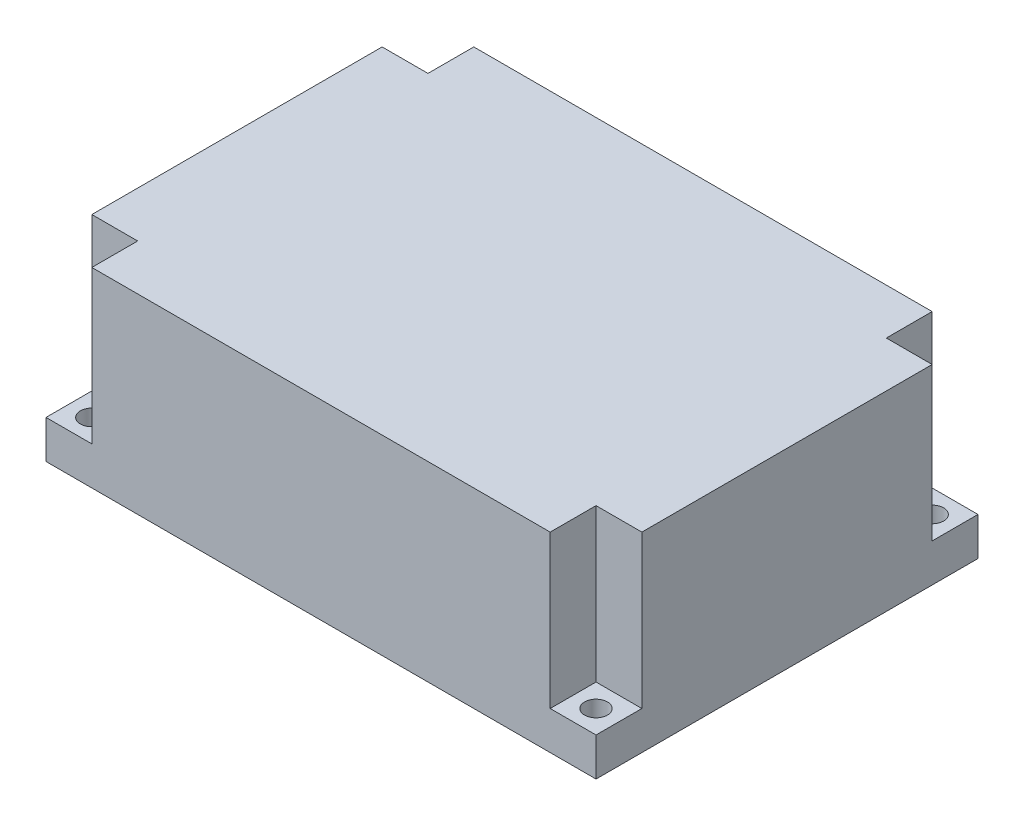
ISO-10303-21;
HEADER;
FILE_DESCRIPTION(('STEP AP214'),'2;1');
FILE_NAME('part.step','',(''),(''),'','','');
FILE_SCHEMA(('AUTOMOTIVE_DESIGN { 1 0 10303 214 1 1 1 1 }'));
ENDSEC;
DATA;
#1=APPLICATION_CONTEXT('core data for automotive mechanical design processes');
#2=APPLICATION_PROTOCOL_DEFINITION('international standard','automotive_design',2000,#1);
#3=PRODUCT_CONTEXT('',#1,'mechanical');
#4=PRODUCT('Part','Part','',(#3));
#5=PRODUCT_RELATED_PRODUCT_CATEGORY('part','',(#4));
#6=PRODUCT_DEFINITION_FORMATION('','',#4);
#7=PRODUCT_DEFINITION_CONTEXT('part definition',#1,'design');
#8=PRODUCT_DEFINITION('design','',#6,#7);
#9=PRODUCT_DEFINITION_SHAPE('','',#8);
#10=(LENGTH_UNIT() NAMED_UNIT(*) SI_UNIT(.MILLI.,.METRE.));
#11=(NAMED_UNIT(*) PLANE_ANGLE_UNIT() SI_UNIT($,.RADIAN.));
#12=(NAMED_UNIT(*) SI_UNIT($,.STERADIAN.) SOLID_ANGLE_UNIT());
#13=UNCERTAINTY_MEASURE_WITH_UNIT(LENGTH_MEASURE(1.E-05),#10,'distance_accuracy_value','');
#14=(GEOMETRIC_REPRESENTATION_CONTEXT(3) GLOBAL_UNCERTAINTY_ASSIGNED_CONTEXT((#13)) GLOBAL_UNIT_ASSIGNED_CONTEXT((#10,
#11,#12)) REPRESENTATION_CONTEXT('',''));
#15=CARTESIAN_POINT('',(0.,0.,0.));
#16=DIRECTION('',(0.,0.,1.));
#17=DIRECTION('',(1.,0.,0.));
#18=AXIS2_PLACEMENT_3D('',#15,#16,#17);
#19=CARTESIAN_POINT('',(-33.,0.,-22.));
#20=DIRECTION('',(0.,1.,0.));
#21=DIRECTION('',(0.,0.,1.));
#22=AXIS2_PLACEMENT_3D('',#19,#20,#21);
#23=CYLINDRICAL_SURFACE('',#22,1.5);
#24=CARTESIAN_POINT('',(-33.,0.,-22.));
#25=DIRECTION('',(0.,1.,0.));
#26=DIRECTION('',(0.,0.,1.));
#27=AXIS2_PLACEMENT_3D('',#24,#25,#26);
#28=CIRCLE('',#27,1.5);
#29=CARTESIAN_POINT('',(-33.,0.,-20.5));
#30=VERTEX_POINT('',#29);
#31=EDGE_CURVE('E185',#30,#30,#28,.T.);
#32=ORIENTED_EDGE('',*,*,#31,.F.);
#33=EDGE_LOOP('',(#32));
#34=FACE_BOUND('',#33,.T.);
#35=CARTESIAN_POINT('',(-33.,5.,-22.));
#36=DIRECTION('',(0.,1.,0.));
#37=DIRECTION('',(0.,0.,1.));
#38=AXIS2_PLACEMENT_3D('',#35,#36,#37);
#39=CIRCLE('',#38,1.5);
#40=CARTESIAN_POINT('',(-33.,5.,-20.5));
#41=VERTEX_POINT('',#40);
#42=EDGE_CURVE('E39',#41,#41,#39,.F.);
#43=ORIENTED_EDGE('',*,*,#42,.F.);
#44=EDGE_LOOP('',(#43));
#45=FACE_BOUND('',#44,.T.);
#46=ADVANCED_FACE('F35',(#34,#45),#23,.F.);
#47=CARTESIAN_POINT('',(33.,0.,22.));
#48=DIRECTION('',(0.,1.,0.));
#49=DIRECTION('',(0.,0.,1.));
#50=AXIS2_PLACEMENT_3D('',#47,#48,#49);
#51=CYLINDRICAL_SURFACE('',#50,1.5);
#52=CARTESIAN_POINT('',(33.,0.,22.));
#53=DIRECTION('',(0.,1.,0.));
#54=DIRECTION('',(0.,0.,1.));
#55=AXIS2_PLACEMENT_3D('',#52,#53,#54);
#56=CIRCLE('',#55,1.5);
#57=CARTESIAN_POINT('',(33.,0.,23.5));
#58=VERTEX_POINT('',#57);
#59=EDGE_CURVE('E220',#58,#58,#56,.T.);
#60=ORIENTED_EDGE('',*,*,#59,.F.);
#61=EDGE_LOOP('',(#60));
#62=FACE_BOUND('',#61,.T.);
#63=CARTESIAN_POINT('',(33.,5.,22.));
#64=DIRECTION('',(0.,1.,0.));
#65=DIRECTION('',(0.,0.,1.));
#66=AXIS2_PLACEMENT_3D('',#63,#64,#65);
#67=CIRCLE('',#66,1.5);
#68=CARTESIAN_POINT('',(33.,5.,23.5));
#69=VERTEX_POINT('',#68);
#70=EDGE_CURVE('E208',#69,#69,#67,.F.);
#71=ORIENTED_EDGE('',*,*,#70,.F.);
#72=EDGE_LOOP('',(#71));
#73=FACE_BOUND('',#72,.T.);
#74=ADVANCED_FACE('F327',(#62,#73),#51,.F.);
#75=CARTESIAN_POINT('',(36.,25.,25.));
#76=DIRECTION('',(-1.,0.,0.));
#77=DIRECTION('',(0.,0.,1.));
#78=AXIS2_PLACEMENT_3D('',#75,#76,#77);
#79=PLANE('',#78);
#80=DIRECTION('',(0.,0.,-1.));
#81=VECTOR('',#80,1.);
#82=CARTESIAN_POINT('',(36.,25.,25.));
#83=LINE('',#82,#81);
#84=CARTESIAN_POINT('',(36.,25.,19.));
#85=VERTEX_POINT('',#84);
#86=CARTESIAN_POINT('',(36.,25.,-19.));
#87=VERTEX_POINT('',#86);
#88=EDGE_CURVE('E200',#85,#87,#83,.T.);
#89=ORIENTED_EDGE('',*,*,#88,.F.);
#90=DIRECTION('',(0.,1.,0.));
#91=VECTOR('',#90,1.);
#92=CARTESIAN_POINT('',(36.,5.,19.));
#93=LINE('',#92,#91);
#94=CARTESIAN_POINT('',(36.,5.,19.));
#95=VERTEX_POINT('',#94);
#96=EDGE_CURVE('E259',#95,#85,#93,.T.);
#97=ORIENTED_EDGE('',*,*,#96,.F.);
#98=DIRECTION('',(0.,0.,-1.));
#99=VECTOR('',#98,1.);
#100=CARTESIAN_POINT('',(36.,5.,25.));
#101=LINE('',#100,#99);
#102=CARTESIAN_POINT('',(36.,5.,25.));
#103=VERTEX_POINT('',#102);
#104=EDGE_CURVE('E535',#103,#95,#101,.T.);
#105=ORIENTED_EDGE('',*,*,#104,.F.);
#106=DIRECTION('',(0.,-1.,0.));
#107=VECTOR('',#106,1.);
#108=CARTESIAN_POINT('',(36.,25.,25.));
#109=LINE('',#108,#107);
#110=CARTESIAN_POINT('',(36.,0.,25.));
#111=VERTEX_POINT('',#110);
#112=EDGE_CURVE('E180',#103,#111,#109,.T.);
#113=ORIENTED_EDGE('',*,*,#112,.T.);
#114=DIRECTION('',(0.,0.,-1.));
#115=VECTOR('',#114,1.);
#116=CARTESIAN_POINT('',(36.,0.,25.));
#117=LINE('',#116,#115);
#118=CARTESIAN_POINT('',(36.,0.,-25.));
#119=VERTEX_POINT('',#118);
#120=EDGE_CURVE('E177',#111,#119,#117,.T.);
#121=ORIENTED_EDGE('',*,*,#120,.T.);
#122=DIRECTION('',(0.,-1.,0.));
#123=VECTOR('',#122,1.);
#124=CARTESIAN_POINT('',(36.,25.,-25.));
#125=LINE('',#124,#123);
#126=CARTESIAN_POINT('',(36.,5.,-25.));
#127=VERTEX_POINT('',#126);
#128=EDGE_CURVE('E11',#127,#119,#125,.T.);
#129=ORIENTED_EDGE('',*,*,#128,.F.);
#130=DIRECTION('',(0.,0.,-1.));
#131=VECTOR('',#130,1.);
#132=CARTESIAN_POINT('',(36.,5.,-25.));
#133=LINE('',#132,#131);
#134=CARTESIAN_POINT('',(36.,5.,-19.));
#135=VERTEX_POINT('',#134);
#136=EDGE_CURVE('E152',#135,#127,#133,.T.);
#137=ORIENTED_EDGE('',*,*,#136,.F.);
#138=DIRECTION('',(0.,1.,0.));
#139=VECTOR('',#138,1.);
#140=CARTESIAN_POINT('',(36.,5.,-19.));
#141=LINE('',#140,#139);
#142=EDGE_CURVE('E300',#135,#87,#141,.T.);
#143=ORIENTED_EDGE('',*,*,#142,.T.);
#144=EDGE_LOOP('',(#89,#97,#105,#113,#121,#129,#137,#143));
#145=FACE_BOUND('',#144,.T.);
#146=ADVANCED_FACE('F37',(#145),#79,.F.);
#147=CARTESIAN_POINT('',(-36.,25.,-25.));
#148=DIRECTION('',(0.,0.,1.));
#149=DIRECTION('',(1.,0.,0.));
#150=AXIS2_PLACEMENT_3D('',#147,#148,#149);
#151=PLANE('',#150);
#152=DIRECTION('',(-1.,0.,0.));
#153=VECTOR('',#152,1.);
#154=CARTESIAN_POINT('',(-36.,25.,-25.));
#155=LINE('',#154,#153);
#156=CARTESIAN_POINT('',(30.,25.,-25.));
#157=VERTEX_POINT('',#156);
#158=CARTESIAN_POINT('',(-30.,25.,-25.));
#159=VERTEX_POINT('',#158);
#160=EDGE_CURVE('E230',#157,#159,#155,.T.);
#161=ORIENTED_EDGE('',*,*,#160,.F.);
#162=DIRECTION('',(0.,1.,0.));
#163=VECTOR('',#162,1.);
#164=CARTESIAN_POINT('',(30.,5.,-25.));
#165=LINE('',#164,#163);
#166=CARTESIAN_POINT('',(30.,5.,-25.));
#167=VERTEX_POINT('',#166);
#168=EDGE_CURVE('E171',#167,#157,#165,.T.);
#169=ORIENTED_EDGE('',*,*,#168,.F.);
#170=DIRECTION('',(-1.,0.,0.));
#171=VECTOR('',#170,1.);
#172=CARTESIAN_POINT('',(36.,5.,-25.));
#173=LINE('',#172,#171);
#174=EDGE_CURVE('E157',#127,#167,#173,.T.);
#175=ORIENTED_EDGE('',*,*,#174,.F.);
#176=ORIENTED_EDGE('',*,*,#128,.T.);
#177=DIRECTION('',(-1.,0.,0.));
#178=VECTOR('',#177,1.);
#179=CARTESIAN_POINT('',(-36.,0.,-25.));
#180=LINE('',#179,#178);
#181=CARTESIAN_POINT('',(-36.,0.,-25.));
#182=VERTEX_POINT('',#181);
#183=EDGE_CURVE('E184',#119,#182,#180,.T.);
#184=ORIENTED_EDGE('',*,*,#183,.T.);
#185=DIRECTION('',(0.,-1.,0.));
#186=VECTOR('',#185,1.);
#187=CARTESIAN_POINT('',(-36.,25.,-25.));
#188=LINE('',#187,#186);
#189=CARTESIAN_POINT('',(-36.,5.,-25.));
#190=VERTEX_POINT('',#189);
#191=EDGE_CURVE('E44',#190,#182,#188,.T.);
#192=ORIENTED_EDGE('',*,*,#191,.F.);
#193=DIRECTION('',(-1.,0.,0.));
#194=VECTOR('',#193,1.);
#195=CARTESIAN_POINT('',(-36.,5.,-25.));
#196=LINE('',#195,#194);
#197=CARTESIAN_POINT('',(-30.,5.,-25.));
#198=VERTEX_POINT('',#197);
#199=EDGE_CURVE('E296',#198,#190,#196,.T.);
#200=ORIENTED_EDGE('',*,*,#199,.F.);
#201=DIRECTION('',(0.,1.,0.));
#202=VECTOR('',#201,1.);
#203=CARTESIAN_POINT('',(-30.,5.,-25.));
#204=LINE('',#203,#202);
#205=EDGE_CURVE('E209',#198,#159,#204,.T.);
#206=ORIENTED_EDGE('',*,*,#205,.T.);
#207=EDGE_LOOP('',(#161,#169,#175,#176,#184,#192,#200,#206));
#208=FACE_BOUND('',#207,.T.);
#209=ADVANCED_FACE('F168',(#208),#151,.F.);
#210=CARTESIAN_POINT('',(-36.,25.,25.));
#211=DIRECTION('',(1.,0.,0.));
#212=DIRECTION('',(0.,0.,-1.));
#213=AXIS2_PLACEMENT_3D('',#210,#211,#212);
#214=PLANE('',#213);
#215=DIRECTION('',(0.,0.,1.));
#216=VECTOR('',#215,1.);
#217=CARTESIAN_POINT('',(-36.,5.,25.));
#218=LINE('',#217,#216);
#219=CARTESIAN_POINT('',(-36.,5.,19.));
#220=VERTEX_POINT('',#219);
#221=CARTESIAN_POINT('',(-36.,5.,25.));
#222=VERTEX_POINT('',#221);
#223=EDGE_CURVE('E265',#220,#222,#218,.T.);
#224=ORIENTED_EDGE('',*,*,#223,.F.);
#225=DIRECTION('',(0.,1.,0.));
#226=VECTOR('',#225,1.);
#227=CARTESIAN_POINT('',(-36.,5.,19.));
#228=LINE('',#227,#226);
#229=CARTESIAN_POINT('',(-36.,25.,19.));
#230=VERTEX_POINT('',#229);
#231=EDGE_CURVE('E279',#220,#230,#228,.T.);
#232=ORIENTED_EDGE('',*,*,#231,.T.);
#233=DIRECTION('',(0.,0.,1.));
#234=VECTOR('',#233,1.);
#235=CARTESIAN_POINT('',(-36.,25.,25.));
#236=LINE('',#235,#234);
#237=CARTESIAN_POINT('',(-36.,25.,-19.));
#238=VERTEX_POINT('',#237);
#239=EDGE_CURVE('E232',#238,#230,#236,.T.);
#240=ORIENTED_EDGE('',*,*,#239,.F.);
#241=DIRECTION('',(0.,1.,0.));
#242=VECTOR('',#241,1.);
#243=CARTESIAN_POINT('',(-36.,5.,-19.));
#244=LINE('',#243,#242);
#245=CARTESIAN_POINT('',(-36.,5.,-19.));
#246=VERTEX_POINT('',#245);
#247=EDGE_CURVE('E60',#246,#238,#244,.T.);
#248=ORIENTED_EDGE('',*,*,#247,.F.);
#249=DIRECTION('',(0.,0.,1.));
#250=VECTOR('',#249,1.);
#251=CARTESIAN_POINT('',(-36.,5.,-25.));
#252=LINE('',#251,#250);
#253=EDGE_CURVE('E286',#190,#246,#252,.T.);
#254=ORIENTED_EDGE('',*,*,#253,.F.);
#255=ORIENTED_EDGE('',*,*,#191,.T.);
#256=DIRECTION('',(0.,0.,1.));
#257=VECTOR('',#256,1.);
#258=CARTESIAN_POINT('',(-36.,0.,25.));
#259=LINE('',#258,#257);
#260=CARTESIAN_POINT('',(-36.,0.,25.));
#261=VERTEX_POINT('',#260);
#262=EDGE_CURVE('E187',#182,#261,#259,.T.);
#263=ORIENTED_EDGE('',*,*,#262,.T.);
#264=DIRECTION('',(0.,-1.,0.));
#265=VECTOR('',#264,1.);
#266=CARTESIAN_POINT('',(-36.,25.,25.));
#267=LINE('',#266,#265);
#268=EDGE_CURVE('E202',#222,#261,#267,.T.);
#269=ORIENTED_EDGE('',*,*,#268,.F.);
#270=EDGE_LOOP('',(#224,#232,#240,#248,#254,#255,#263,#269));
#271=FACE_BOUND('',#270,.T.);
#272=ADVANCED_FACE('F341',(#271),#214,.F.);
#273=CARTESIAN_POINT('',(-36.,25.,25.));
#274=DIRECTION('',(0.,0.,-1.));
#275=DIRECTION('',(-1.,0.,0.));
#276=AXIS2_PLACEMENT_3D('',#273,#274,#275);
#277=PLANE('',#276);
#278=DIRECTION('',(1.,0.,0.));
#279=VECTOR('',#278,1.);
#280=CARTESIAN_POINT('',(-36.,25.,25.));
#281=LINE('',#280,#279);
#282=CARTESIAN_POINT('',(-30.,25.,25.));
#283=VERTEX_POINT('',#282);
#284=CARTESIAN_POINT('',(30.,25.,25.));
#285=VERTEX_POINT('',#284);
#286=EDGE_CURVE('E193',#283,#285,#281,.T.);
#287=ORIENTED_EDGE('',*,*,#286,.F.);
#288=DIRECTION('',(0.,1.,0.));
#289=VECTOR('',#288,1.);
#290=CARTESIAN_POINT('',(-30.,5.,25.));
#291=LINE('',#290,#289);
#292=CARTESIAN_POINT('',(-30.,5.,25.));
#293=VERTEX_POINT('',#292);
#294=EDGE_CURVE('E52',#293,#283,#291,.T.);
#295=ORIENTED_EDGE('',*,*,#294,.F.);
#296=DIRECTION('',(1.,0.,0.));
#297=VECTOR('',#296,1.);
#298=CARTESIAN_POINT('',(-36.,5.,25.));
#299=LINE('',#298,#297);
#300=EDGE_CURVE('E267',#222,#293,#299,.T.);
#301=ORIENTED_EDGE('',*,*,#300,.F.);
#302=ORIENTED_EDGE('',*,*,#268,.T.);
#303=DIRECTION('',(1.,0.,0.));
#304=VECTOR('',#303,1.);
#305=CARTESIAN_POINT('',(-36.,0.,25.));
#306=LINE('',#305,#304);
#307=EDGE_CURVE('E198',#261,#111,#306,.T.);
#308=ORIENTED_EDGE('',*,*,#307,.T.);
#309=ORIENTED_EDGE('',*,*,#112,.F.);
#310=DIRECTION('',(1.,0.,0.));
#311=VECTOR('',#310,1.);
#312=CARTESIAN_POINT('',(36.,5.,25.));
#313=LINE('',#312,#311);
#314=CARTESIAN_POINT('',(30.,5.,25.));
#315=VERTEX_POINT('',#314);
#316=EDGE_CURVE('E250',#315,#103,#313,.T.);
#317=ORIENTED_EDGE('',*,*,#316,.F.);
#318=DIRECTION('',(0.,1.,0.));
#319=VECTOR('',#318,1.);
#320=CARTESIAN_POINT('',(30.,5.,25.));
#321=LINE('',#320,#319);
#322=EDGE_CURVE('E249',#315,#285,#321,.T.);
#323=ORIENTED_EDGE('',*,*,#322,.T.);
#324=EDGE_LOOP('',(#287,#295,#301,#302,#308,#309,#317,#323));
#325=FACE_BOUND('',#324,.T.);
#326=ADVANCED_FACE('F246',(#325),#277,.F.);
#327=CARTESIAN_POINT('',(0.,25.,0.));
#328=DIRECTION('',(0.,-1.,0.));
#329=DIRECTION('',(0.,0.,-1.));
#330=AXIS2_PLACEMENT_3D('',#327,#328,#329);
#331=PLANE('',#330);
#332=ORIENTED_EDGE('',*,*,#239,.T.);
#333=DIRECTION('',(-1.,0.,0.));
#334=VECTOR('',#333,1.);
#335=CARTESIAN_POINT('',(-36.,25.,19.));
#336=LINE('',#335,#334);
#337=CARTESIAN_POINT('',(-30.,25.,19.));
#338=VERTEX_POINT('',#337);
#339=EDGE_CURVE('E268',#338,#230,#336,.T.);
#340=ORIENTED_EDGE('',*,*,#339,.F.);
#341=DIRECTION('',(0.,0.,-1.));
#342=VECTOR('',#341,1.);
#343=CARTESIAN_POINT('',(-30.,25.,25.));
#344=LINE('',#343,#342);
#345=EDGE_CURVE('E243',#283,#338,#344,.T.);
#346=ORIENTED_EDGE('',*,*,#345,.F.);
#347=ORIENTED_EDGE('',*,*,#286,.T.);
#348=DIRECTION('',(0.,0.,1.));
#349=VECTOR('',#348,1.);
#350=CARTESIAN_POINT('',(30.,25.,25.));
#351=LINE('',#350,#349);
#352=CARTESIAN_POINT('',(30.,25.,19.));
#353=VERTEX_POINT('',#352);
#354=EDGE_CURVE('E242',#353,#285,#351,.T.);
#355=ORIENTED_EDGE('',*,*,#354,.F.);
#356=DIRECTION('',(-1.,0.,0.));
#357=VECTOR('',#356,1.);
#358=CARTESIAN_POINT('',(36.,25.,19.));
#359=LINE('',#358,#357);
#360=EDGE_CURVE('E282',#85,#353,#359,.T.);
#361=ORIENTED_EDGE('',*,*,#360,.F.);
#362=ORIENTED_EDGE('',*,*,#88,.T.);
#363=DIRECTION('',(1.,0.,0.));
#364=VECTOR('',#363,1.);
#365=CARTESIAN_POINT('',(36.,25.,-19.));
#366=LINE('',#365,#364);
#367=CARTESIAN_POINT('',(30.,25.,-19.));
#368=VERTEX_POINT('',#367);
#369=EDGE_CURVE('E164',#368,#87,#366,.T.);
#370=ORIENTED_EDGE('',*,*,#369,.F.);
#371=DIRECTION('',(0.,0.,1.));
#372=VECTOR('',#371,1.);
#373=CARTESIAN_POINT('',(30.,25.,-25.));
#374=LINE('',#373,#372);
#375=EDGE_CURVE('E254',#157,#368,#374,.T.);
#376=ORIENTED_EDGE('',*,*,#375,.F.);
#377=ORIENTED_EDGE('',*,*,#160,.T.);
#378=DIRECTION('',(0.,0.,-1.));
#379=VECTOR('',#378,1.);
#380=CARTESIAN_POINT('',(-30.,25.,-25.));
#381=LINE('',#380,#379);
#382=CARTESIAN_POINT('',(-30.,25.,-19.));
#383=VERTEX_POINT('',#382);
#384=EDGE_CURVE('E290',#383,#159,#381,.T.);
#385=ORIENTED_EDGE('',*,*,#384,.F.);
#386=DIRECTION('',(1.,0.,0.));
#387=VECTOR('',#386,1.);
#388=CARTESIAN_POINT('',(-36.,25.,-19.));
#389=LINE('',#388,#387);
#390=EDGE_CURVE('E298',#238,#383,#389,.T.);
#391=ORIENTED_EDGE('',*,*,#390,.F.);
#392=EDGE_LOOP('',(#332,#340,#346,#347,#355,#361,#362,#370,#376,#377,#385,#391));
#393=FACE_BOUND('',#392,.T.);
#394=ADVANCED_FACE('F240',(#393),#331,.F.);
#395=CARTESIAN_POINT('',(0.,0.,0.));
#396=DIRECTION('',(0.,-1.,0.));
#397=DIRECTION('',(0.,0.,-1.));
#398=AXIS2_PLACEMENT_3D('',#395,#396,#397);
#399=PLANE('',#398);
#400=CARTESIAN_POINT('',(-33.,0.,22.));
#401=DIRECTION('',(0.,1.,0.));
#402=DIRECTION('',(0.,0.,-1.));
#403=AXIS2_PLACEMENT_3D('',#400,#401,#402);
#404=CIRCLE('',#403,1.5);
#405=CARTESIAN_POINT('',(-33.,0.,20.5));
#406=VERTEX_POINT('',#405);
#407=EDGE_CURVE('E216',#406,#406,#404,.T.);
#408=ORIENTED_EDGE('',*,*,#407,.T.);
#409=EDGE_LOOP('',(#408));
#410=FACE_BOUND('',#409,.T.);
#411=ORIENTED_EDGE('',*,*,#59,.T.);
#412=EDGE_LOOP('',(#411));
#413=FACE_BOUND('',#412,.T.);
#414=CARTESIAN_POINT('',(33.,0.,-22.));
#415=DIRECTION('',(0.,1.,0.));
#416=DIRECTION('',(0.,0.,-1.));
#417=AXIS2_PLACEMENT_3D('',#414,#415,#416);
#418=CIRCLE('',#417,1.5);
#419=CARTESIAN_POINT('',(33.,0.,-23.5));
#420=VERTEX_POINT('',#419);
#421=EDGE_CURVE('E190',#420,#420,#418,.T.);
#422=ORIENTED_EDGE('',*,*,#421,.T.);
#423=EDGE_LOOP('',(#422));
#424=FACE_BOUND('',#423,.T.);
#425=ORIENTED_EDGE('',*,*,#31,.T.);
#426=EDGE_LOOP('',(#425));
#427=FACE_BOUND('',#426,.T.);
#428=ORIENTED_EDGE('',*,*,#120,.F.);
#429=ORIENTED_EDGE('',*,*,#307,.F.);
#430=ORIENTED_EDGE('',*,*,#262,.F.);
#431=ORIENTED_EDGE('',*,*,#183,.F.);
#432=EDGE_LOOP('',(#428,#429,#430,#431));
#433=FACE_BOUND('',#432,.T.);
#434=ADVANCED_FACE('F309',(#410,#413,#424,#427,#433),#399,.T.);
#435=CARTESIAN_POINT('',(33.,0.,-22.));
#436=DIRECTION('',(0.,1.,0.));
#437=DIRECTION('',(0.,0.,1.));
#438=AXIS2_PLACEMENT_3D('',#435,#436,#437);
#439=CYLINDRICAL_SURFACE('',#438,1.5);
#440=CARTESIAN_POINT('',(33.,5.,-22.));
#441=DIRECTION('',(0.,-1.,0.));
#442=DIRECTION('',(0.,0.,-1.));
#443=AXIS2_PLACEMENT_3D('',#440,#441,#442);
#444=CIRCLE('',#443,1.5);
#445=CARTESIAN_POINT('',(33.,5.,-23.5));
#446=VERTEX_POINT('',#445);
#447=EDGE_CURVE('E211',#446,#446,#444,.F.);
#448=ORIENTED_EDGE('',*,*,#447,.T.);
#449=EDGE_LOOP('',(#448));
#450=FACE_BOUND('',#449,.T.);
#451=ORIENTED_EDGE('',*,*,#421,.F.);
#452=EDGE_LOOP('',(#451));
#453=FACE_BOUND('',#452,.T.);
#454=ADVANCED_FACE('F312',(#450,#453),#439,.F.);
#455=CARTESIAN_POINT('',(-33.,0.,22.));
#456=DIRECTION('',(0.,1.,0.));
#457=DIRECTION('',(0.,0.,1.));
#458=AXIS2_PLACEMENT_3D('',#455,#456,#457);
#459=CYLINDRICAL_SURFACE('',#458,1.5);
#460=CARTESIAN_POINT('',(-33.,5.,22.));
#461=DIRECTION('',(0.,-1.,0.));
#462=DIRECTION('',(0.,0.,-1.));
#463=AXIS2_PLACEMENT_3D('',#460,#461,#462);
#464=CIRCLE('',#463,1.5);
#465=CARTESIAN_POINT('',(-33.,5.,20.5));
#466=VERTEX_POINT('',#465);
#467=EDGE_CURVE('E205',#466,#466,#464,.F.);
#468=ORIENTED_EDGE('',*,*,#467,.T.);
#469=EDGE_LOOP('',(#468));
#470=FACE_BOUND('',#469,.T.);
#471=ORIENTED_EDGE('',*,*,#407,.F.);
#472=EDGE_LOOP('',(#471));
#473=FACE_BOUND('',#472,.T.);
#474=ADVANCED_FACE('F314',(#470,#473),#459,.F.);
#475=CARTESIAN_POINT('',(0.,5.,0.));
#476=DIRECTION('',(0.,-1.,0.));
#477=DIRECTION('',(0.,0.,-1.));
#478=AXIS2_PLACEMENT_3D('',#475,#476,#477);
#479=PLANE('',#478);
#480=ORIENTED_EDGE('',*,*,#223,.T.);
#481=ORIENTED_EDGE('',*,*,#300,.T.);
#482=DIRECTION('',(0.,0.,-1.));
#483=VECTOR('',#482,1.);
#484=CARTESIAN_POINT('',(-30.,5.,25.));
#485=LINE('',#484,#483);
#486=CARTESIAN_POINT('',(-30.,5.,19.));
#487=VERTEX_POINT('',#486);
#488=EDGE_CURVE('E271',#293,#487,#485,.T.);
#489=ORIENTED_EDGE('',*,*,#488,.T.);
#490=DIRECTION('',(-1.,0.,0.));
#491=VECTOR('',#490,1.);
#492=CARTESIAN_POINT('',(-36.,5.,19.));
#493=LINE('',#492,#491);
#494=EDGE_CURVE('E274',#487,#220,#493,.T.);
#495=ORIENTED_EDGE('',*,*,#494,.T.);
#496=EDGE_LOOP('',(#480,#481,#489,#495));
#497=FACE_BOUND('',#496,.T.);
#498=ORIENTED_EDGE('',*,*,#467,.F.);
#499=EDGE_LOOP('',(#498));
#500=FACE_BOUND('',#499,.T.);
#501=ADVANCED_FACE('F320',(#497,#500),#479,.F.);
#502=CARTESIAN_POINT('',(-36.,5.,19.));
#503=DIRECTION('',(0.,0.,-1.));
#504=DIRECTION('',(-1.,0.,0.));
#505=AXIS2_PLACEMENT_3D('',#502,#503,#504);
#506=PLANE('',#505);
#507=ORIENTED_EDGE('',*,*,#339,.T.);
#508=ORIENTED_EDGE('',*,*,#231,.F.);
#509=ORIENTED_EDGE('',*,*,#494,.F.);
#510=DIRECTION('',(0.,1.,0.));
#511=VECTOR('',#510,1.);
#512=CARTESIAN_POINT('',(-30.,5.,19.));
#513=LINE('',#512,#511);
#514=EDGE_CURVE('E283',#487,#338,#513,.T.);
#515=ORIENTED_EDGE('',*,*,#514,.T.);
#516=EDGE_LOOP('',(#507,#508,#509,#515));
#517=FACE_BOUND('',#516,.T.);
#518=ADVANCED_FACE('F407',(#517),#506,.F.);
#519=CARTESIAN_POINT('',(-30.,5.,25.));
#520=DIRECTION('',(1.,0.,0.));
#521=DIRECTION('',(0.,0.,-1.));
#522=AXIS2_PLACEMENT_3D('',#519,#520,#521);
#523=PLANE('',#522);
#524=ORIENTED_EDGE('',*,*,#345,.T.);
#525=ORIENTED_EDGE('',*,*,#514,.F.);
#526=ORIENTED_EDGE('',*,*,#488,.F.);
#527=ORIENTED_EDGE('',*,*,#294,.T.);
#528=EDGE_LOOP('',(#524,#525,#526,#527));
#529=FACE_BOUND('',#528,.T.);
#530=ADVANCED_FACE('F417',(#529),#523,.F.);
#531=CARTESIAN_POINT('',(0.,5.,0.));
#532=DIRECTION('',(0.,1.,0.));
#533=DIRECTION('',(0.,0.,1.));
#534=AXIS2_PLACEMENT_3D('',#531,#532,#533);
#535=PLANE('',#534);
#536=ORIENTED_EDGE('',*,*,#104,.T.);
#537=DIRECTION('',(-1.,0.,0.));
#538=VECTOR('',#537,1.);
#539=CARTESIAN_POINT('',(36.,5.,19.));
#540=LINE('',#539,#538);
#541=CARTESIAN_POINT('',(30.,5.,19.));
#542=VERTEX_POINT('',#541);
#543=EDGE_CURVE('E538',#95,#542,#540,.T.);
#544=ORIENTED_EDGE('',*,*,#543,.T.);
#545=DIRECTION('',(0.,0.,1.));
#546=VECTOR('',#545,1.);
#547=CARTESIAN_POINT('',(30.,5.,25.));
#548=LINE('',#547,#546);
#549=EDGE_CURVE('E541',#542,#315,#548,.T.);
#550=ORIENTED_EDGE('',*,*,#549,.T.);
#551=ORIENTED_EDGE('',*,*,#316,.T.);
#552=EDGE_LOOP('',(#536,#544,#550,#551));
#553=FACE_BOUND('',#552,.T.);
#554=ORIENTED_EDGE('',*,*,#70,.T.);
#555=EDGE_LOOP('',(#554));
#556=FACE_BOUND('',#555,.T.);
#557=ADVANCED_FACE('F427',(#553,#556),#535,.T.);
#558=CARTESIAN_POINT('',(30.,5.,25.));
#559=DIRECTION('',(-1.,0.,0.));
#560=DIRECTION('',(0.,0.,1.));
#561=AXIS2_PLACEMENT_3D('',#558,#559,#560);
#562=PLANE('',#561);
#563=ORIENTED_EDGE('',*,*,#354,.T.);
#564=ORIENTED_EDGE('',*,*,#322,.F.);
#565=ORIENTED_EDGE('',*,*,#549,.F.);
#566=DIRECTION('',(0.,1.,0.));
#567=VECTOR('',#566,1.);
#568=CARTESIAN_POINT('',(30.,5.,19.));
#569=LINE('',#568,#567);
#570=EDGE_CURVE('E255',#542,#353,#569,.T.);
#571=ORIENTED_EDGE('',*,*,#570,.T.);
#572=EDGE_LOOP('',(#563,#564,#565,#571));
#573=FACE_BOUND('',#572,.T.);
#574=ADVANCED_FACE('F436',(#573),#562,.F.);
#575=CARTESIAN_POINT('',(36.,5.,19.));
#576=DIRECTION('',(0.,0.,-1.));
#577=DIRECTION('',(-1.,0.,0.));
#578=AXIS2_PLACEMENT_3D('',#575,#576,#577);
#579=PLANE('',#578);
#580=ORIENTED_EDGE('',*,*,#360,.T.);
#581=ORIENTED_EDGE('',*,*,#570,.F.);
#582=ORIENTED_EDGE('',*,*,#543,.F.);
#583=ORIENTED_EDGE('',*,*,#96,.T.);
#584=EDGE_LOOP('',(#580,#581,#582,#583));
#585=FACE_BOUND('',#584,.T.);
#586=ADVANCED_FACE('F446',(#585),#579,.F.);
#587=CARTESIAN_POINT('',(0.,5.,0.));
#588=DIRECTION('',(0.,-1.,0.));
#589=DIRECTION('',(0.,0.,-1.));
#590=AXIS2_PLACEMENT_3D('',#587,#588,#589);
#591=PLANE('',#590);
#592=ORIENTED_EDGE('',*,*,#136,.T.);
#593=ORIENTED_EDGE('',*,*,#174,.T.);
#594=DIRECTION('',(0.,0.,1.));
#595=VECTOR('',#594,1.);
#596=CARTESIAN_POINT('',(30.,5.,-25.));
#597=LINE('',#596,#595);
#598=CARTESIAN_POINT('',(30.,5.,-19.));
#599=VERTEX_POINT('',#598);
#600=EDGE_CURVE('E172',#167,#599,#597,.T.);
#601=ORIENTED_EDGE('',*,*,#600,.T.);
#602=DIRECTION('',(1.,0.,0.));
#603=VECTOR('',#602,1.);
#604=CARTESIAN_POINT('',(36.,5.,-19.));
#605=LINE('',#604,#603);
#606=EDGE_CURVE('E160',#599,#135,#605,.T.);
#607=ORIENTED_EDGE('',*,*,#606,.T.);
#608=EDGE_LOOP('',(#592,#593,#601,#607));
#609=FACE_BOUND('',#608,.T.);
#610=ORIENTED_EDGE('',*,*,#447,.F.);
#611=EDGE_LOOP('',(#610));
#612=FACE_BOUND('',#611,.T.);
#613=ADVANCED_FACE('F154',(#609,#612),#591,.F.);
#614=CARTESIAN_POINT('',(36.,5.,-19.));
#615=DIRECTION('',(0.,0.,1.));
#616=DIRECTION('',(1.,0.,0.));
#617=AXIS2_PLACEMENT_3D('',#614,#615,#616);
#618=PLANE('',#617);
#619=ORIENTED_EDGE('',*,*,#369,.T.);
#620=ORIENTED_EDGE('',*,*,#142,.F.);
#621=ORIENTED_EDGE('',*,*,#606,.F.);
#622=DIRECTION('',(0.,1.,0.));
#623=VECTOR('',#622,1.);
#624=CARTESIAN_POINT('',(30.,5.,-19.));
#625=LINE('',#624,#623);
#626=EDGE_CURVE('E529',#599,#368,#625,.T.);
#627=ORIENTED_EDGE('',*,*,#626,.T.);
#628=EDGE_LOOP('',(#619,#620,#621,#627));
#629=FACE_BOUND('',#628,.T.);
#630=ADVANCED_FACE('F464',(#629),#618,.F.);
#631=CARTESIAN_POINT('',(30.,5.,-25.));
#632=DIRECTION('',(-1.,0.,0.));
#633=DIRECTION('',(0.,0.,1.));
#634=AXIS2_PLACEMENT_3D('',#631,#632,#633);
#635=PLANE('',#634);
#636=ORIENTED_EDGE('',*,*,#375,.T.);
#637=ORIENTED_EDGE('',*,*,#626,.F.);
#638=ORIENTED_EDGE('',*,*,#600,.F.);
#639=ORIENTED_EDGE('',*,*,#168,.T.);
#640=EDGE_LOOP('',(#636,#637,#638,#639));
#641=FACE_BOUND('',#640,.T.);
#642=ADVANCED_FACE('F473',(#641),#635,.F.);
#643=CARTESIAN_POINT('',(0.,5.,0.));
#644=DIRECTION('',(0.,1.,0.));
#645=DIRECTION('',(0.,0.,1.));
#646=AXIS2_PLACEMENT_3D('',#643,#644,#645);
#647=PLANE('',#646);
#648=ORIENTED_EDGE('',*,*,#253,.T.);
#649=DIRECTION('',(1.,0.,0.));
#650=VECTOR('',#649,1.);
#651=CARTESIAN_POINT('',(-36.,5.,-19.));
#652=LINE('',#651,#650);
#653=CARTESIAN_POINT('',(-30.,5.,-19.));
#654=VERTEX_POINT('',#653);
#655=EDGE_CURVE('E289',#246,#654,#652,.T.);
#656=ORIENTED_EDGE('',*,*,#655,.T.);
#657=DIRECTION('',(0.,0.,-1.));
#658=VECTOR('',#657,1.);
#659=CARTESIAN_POINT('',(-30.,5.,-25.));
#660=LINE('',#659,#658);
#661=EDGE_CURVE('E293',#654,#198,#660,.T.);
#662=ORIENTED_EDGE('',*,*,#661,.T.);
#663=ORIENTED_EDGE('',*,*,#199,.T.);
#664=EDGE_LOOP('',(#648,#656,#662,#663));
#665=FACE_BOUND('',#664,.T.);
#666=ORIENTED_EDGE('',*,*,#42,.T.);
#667=EDGE_LOOP('',(#666));
#668=FACE_BOUND('',#667,.T.);
#669=ADVANCED_FACE('F483',(#665,#668),#647,.T.);
#670=CARTESIAN_POINT('',(-30.,5.,-25.));
#671=DIRECTION('',(1.,0.,0.));
#672=DIRECTION('',(0.,0.,-1.));
#673=AXIS2_PLACEMENT_3D('',#670,#671,#672);
#674=PLANE('',#673);
#675=ORIENTED_EDGE('',*,*,#384,.T.);
#676=ORIENTED_EDGE('',*,*,#205,.F.);
#677=ORIENTED_EDGE('',*,*,#661,.F.);
#678=DIRECTION('',(0.,1.,0.));
#679=VECTOR('',#678,1.);
#680=CARTESIAN_POINT('',(-30.,5.,-19.));
#681=LINE('',#680,#679);
#682=EDGE_CURVE('E304',#654,#383,#681,.T.);
#683=ORIENTED_EDGE('',*,*,#682,.T.);
#684=EDGE_LOOP('',(#675,#676,#677,#683));
#685=FACE_BOUND('',#684,.T.);
#686=ADVANCED_FACE('F493',(#685),#674,.F.);
#687=CARTESIAN_POINT('',(-36.,5.,-19.));
#688=DIRECTION('',(0.,0.,1.));
#689=DIRECTION('',(1.,0.,0.));
#690=AXIS2_PLACEMENT_3D('',#687,#688,#689);
#691=PLANE('',#690);
#692=ORIENTED_EDGE('',*,*,#390,.T.);
#693=ORIENTED_EDGE('',*,*,#682,.F.);
#694=ORIENTED_EDGE('',*,*,#655,.F.);
#695=ORIENTED_EDGE('',*,*,#247,.T.);
#696=EDGE_LOOP('',(#692,#693,#694,#695));
#697=FACE_BOUND('',#696,.T.);
#698=ADVANCED_FACE('F503',(#697),#691,.F.);
#699=CLOSED_SHELL('',(#46,#74,#146,#209,#272,#326,#394,#434,#454,#474,#501,#518,#530,#557,#574,
#586,#613,#630,#642,#669,#686,#698));
#700=MANIFOLD_SOLID_BREP('B2',#699);
#701=ADVANCED_BREP_SHAPE_REPRESENTATION('',(#18,#700),#14);
#702=SHAPE_DEFINITION_REPRESENTATION(#9,#701);
ENDSEC;
END-ISO-10303-21;
